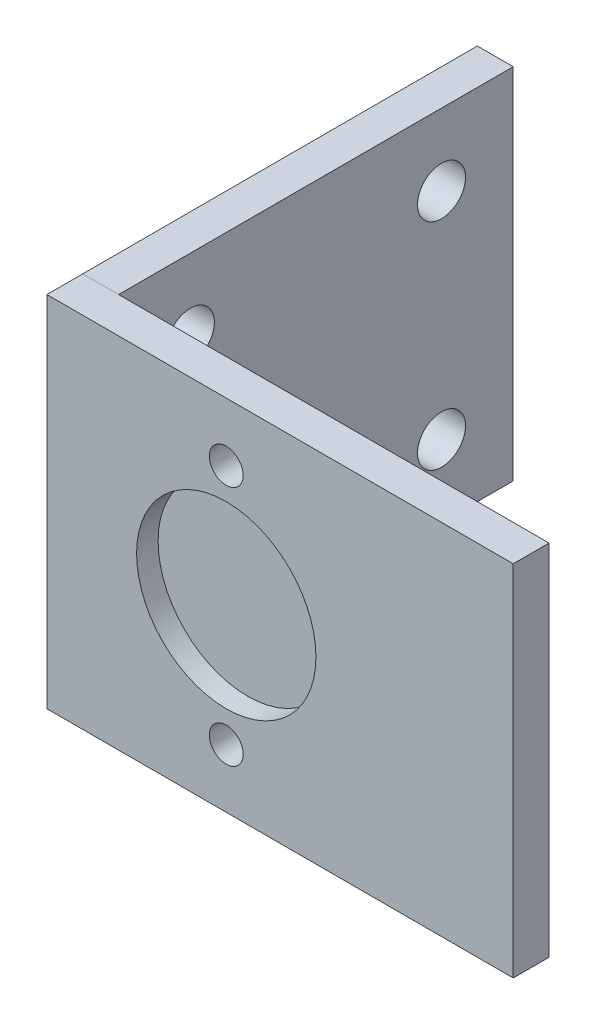
ISO-10303-21;
HEADER;
FILE_DESCRIPTION(('STEP AP214'),'2;1');
FILE_NAME('part.step','',(''),(''),'','','');
FILE_SCHEMA(('AUTOMOTIVE_DESIGN { 1 0 10303 214 1 1 1 1 }'));
ENDSEC;
DATA;
#1=APPLICATION_CONTEXT('core data for automotive mechanical design processes');
#2=APPLICATION_PROTOCOL_DEFINITION('international standard','automotive_design',2000,#1);
#3=PRODUCT_CONTEXT('',#1,'mechanical');
#4=PRODUCT('Part','Part','',(#3));
#5=PRODUCT_RELATED_PRODUCT_CATEGORY('part','',(#4));
#6=PRODUCT_DEFINITION_FORMATION('','',#4);
#7=PRODUCT_DEFINITION_CONTEXT('part definition',#1,'design');
#8=PRODUCT_DEFINITION('design','',#6,#7);
#9=PRODUCT_DEFINITION_SHAPE('','',#8);
#10=(LENGTH_UNIT() NAMED_UNIT(*) SI_UNIT(.MILLI.,.METRE.));
#11=(NAMED_UNIT(*) PLANE_ANGLE_UNIT() SI_UNIT($,.RADIAN.));
#12=(NAMED_UNIT(*) SI_UNIT($,.STERADIAN.) SOLID_ANGLE_UNIT());
#13=UNCERTAINTY_MEASURE_WITH_UNIT(LENGTH_MEASURE(1.E-05),#10,'distance_accuracy_value','');
#14=(GEOMETRIC_REPRESENTATION_CONTEXT(3) GLOBAL_UNCERTAINTY_ASSIGNED_CONTEXT((#13)) GLOBAL_UNIT_ASSIGNED_CONTEXT((#10,
#11,#12)) REPRESENTATION_CONTEXT('',''));
#15=CARTESIAN_POINT('',(0.,0.,0.));
#16=DIRECTION('',(0.,0.,1.));
#17=DIRECTION('',(1.,0.,0.));
#18=AXIS2_PLACEMENT_3D('',#15,#16,#17);
#19=CARTESIAN_POINT('',(0.,16.736305379031,45.8468437795348));
#20=DIRECTION('',(0.,0.,-1.));
#21=DIRECTION('',(-1.,0.,0.));
#22=AXIS2_PLACEMENT_3D('',#19,#20,#21);
#23=PLANE('',#22);
#24=CARTESIAN_POINT('',(12.7,12.5863053790309,45.8468437795348));
#25=DIRECTION('',(0.,0.,-1.));
#26=DIRECTION('',(-1.,0.,0.));
#27=AXIS2_PLACEMENT_3D('',#24,#25,#26);
#28=CIRCLE('',#27,1.19999999999999);
#29=CARTESIAN_POINT('',(11.5,12.5863053790309,45.8468437795348));
#30=VERTEX_POINT('',#29);
#31=EDGE_CURVE('E142',#30,#30,#28,.T.);
#32=ORIENTED_EDGE('',*,*,#31,.F.);
#33=EDGE_LOOP('',(#32));
#34=FACE_BOUND('',#33,.T.);
#35=CARTESIAN_POINT('',(12.7,-4.51369462096898,45.8468437795348));
#36=DIRECTION('',(0.,0.,-1.));
#37=DIRECTION('',(-1.,0.,0.));
#38=AXIS2_PLACEMENT_3D('',#35,#36,#37);
#39=CIRCLE('',#38,1.19999999999999);
#40=CARTESIAN_POINT('',(11.5,-4.51369462096898,45.8468437795348));
#41=VERTEX_POINT('',#40);
#42=EDGE_CURVE('E103',#41,#41,#39,.T.);
#43=ORIENTED_EDGE('',*,*,#42,.F.);
#44=EDGE_LOOP('',(#43));
#45=FACE_BOUND('',#44,.T.);
#46=DIRECTION('',(1.,0.,0.));
#47=VECTOR('',#46,1.);
#48=CARTESIAN_POINT('',(0.,16.736305379031,45.8468437795348));
#49=LINE('',#48,#47);
#50=CARTESIAN_POINT('',(0.,16.736305379031,45.8468437795348));
#51=VERTEX_POINT('',#50);
#52=CARTESIAN_POINT('',(33.02,16.736305379031,45.8468437795348));
#53=VERTEX_POINT('',#52);
#54=EDGE_CURVE('E48',#51,#53,#49,.T.);
#55=ORIENTED_EDGE('',*,*,#54,.T.);
#56=DIRECTION('',(0.,1.,0.));
#57=VECTOR('',#56,1.);
#58=CARTESIAN_POINT('',(33.02,16.736305379031,45.8468437795348));
#59=LINE('',#58,#57);
#60=CARTESIAN_POINT('',(33.02,-8.66369462096904,45.8468437795348));
#61=VERTEX_POINT('',#60);
#62=EDGE_CURVE('E85',#61,#53,#59,.T.);
#63=ORIENTED_EDGE('',*,*,#62,.F.);
#64=DIRECTION('',(1.,0.,0.));
#65=VECTOR('',#64,1.);
#66=CARTESIAN_POINT('',(0.,-8.66369462096904,45.8468437795348));
#67=LINE('',#66,#65);
#68=CARTESIAN_POINT('',(0.,-8.66369462096904,45.8468437795348));
#69=VERTEX_POINT('',#68);
#70=EDGE_CURVE('E12',#69,#61,#67,.T.);
#71=ORIENTED_EDGE('',*,*,#70,.F.);
#72=DIRECTION('',(0.,1.,0.));
#73=VECTOR('',#72,1.);
#74=CARTESIAN_POINT('',(0.,16.736305379031,45.8468437795348));
#75=LINE('',#74,#73);
#76=EDGE_CURVE('E86',#69,#51,#75,.T.);
#77=ORIENTED_EDGE('',*,*,#76,.T.);
#78=EDGE_LOOP('',(#55,#63,#71,#77));
#79=FACE_BOUND('',#78,.T.);
#80=ADVANCED_FACE('F45',(#34,#45,#79),#23,.T.);
#81=CARTESIAN_POINT('',(0.,-8.66369462096904,48.3868437795348));
#82=DIRECTION('',(0.,-1.,0.));
#83=DIRECTION('',(0.,0.,-1.));
#84=AXIS2_PLACEMENT_3D('',#81,#82,#83);
#85=PLANE('',#84);
#86=ORIENTED_EDGE('',*,*,#70,.T.);
#87=DIRECTION('',(0.,0.,-1.));
#88=VECTOR('',#87,1.);
#89=CARTESIAN_POINT('',(33.02,-8.66369462096904,48.3868437795348));
#90=LINE('',#89,#88);
#91=CARTESIAN_POINT('',(33.02,-8.66369462096904,48.3868437795348));
#92=VERTEX_POINT('',#91);
#93=EDGE_CURVE('E102',#92,#61,#90,.T.);
#94=ORIENTED_EDGE('',*,*,#93,.F.);
#95=DIRECTION('',(1.,0.,0.));
#96=VECTOR('',#95,1.);
#97=CARTESIAN_POINT('',(0.,-8.66369462096904,48.3868437795348));
#98=LINE('',#97,#96);
#99=CARTESIAN_POINT('',(0.,-8.66369462096904,48.3868437795348));
#100=VERTEX_POINT('',#99);
#101=EDGE_CURVE('E53',#100,#92,#98,.T.);
#102=ORIENTED_EDGE('',*,*,#101,.F.);
#103=DIRECTION('',(0.,0.,-1.));
#104=VECTOR('',#103,1.);
#105=CARTESIAN_POINT('',(0.,-8.66369462096904,48.3868437795348));
#106=LINE('',#105,#104);
#107=EDGE_CURVE('E91',#100,#69,#106,.T.);
#108=ORIENTED_EDGE('',*,*,#107,.T.);
#109=EDGE_LOOP('',(#86,#94,#102,#108));
#110=FACE_BOUND('',#109,.T.);
#111=ADVANCED_FACE('F122',(#110),#85,.T.);
#112=CARTESIAN_POINT('',(0.,16.736305379031,48.3868437795348));
#113=DIRECTION('',(0.,0.,1.));
#114=DIRECTION('',(1.,0.,0.));
#115=AXIS2_PLACEMENT_3D('',#112,#113,#114);
#116=PLANE('',#115);
#117=CARTESIAN_POINT('',(12.7,4.03630537903097,48.3868437795348));
#118=DIRECTION('',(0.,0.,1.));
#119=DIRECTION('',(1.,0.,0.));
#120=AXIS2_PLACEMENT_3D('',#117,#118,#119);
#121=CIRCLE('',#120,6.35);
#122=CARTESIAN_POINT('',(19.05,4.03630537903097,48.3868437795348));
#123=VERTEX_POINT('',#122);
#124=EDGE_CURVE('E158',#123,#123,#121,.T.);
#125=ORIENTED_EDGE('',*,*,#124,.F.);
#126=EDGE_LOOP('',(#125));
#127=FACE_BOUND('',#126,.T.);
#128=CARTESIAN_POINT('',(12.7,12.5863053790309,48.3868437795348));
#129=DIRECTION('',(0.,0.,1.));
#130=DIRECTION('',(1.,0.,0.));
#131=AXIS2_PLACEMENT_3D('',#128,#129,#130);
#132=CIRCLE('',#131,1.19999999999999);
#133=CARTESIAN_POINT('',(13.9,12.5863053790309,48.3868437795348));
#134=VERTEX_POINT('',#133);
#135=EDGE_CURVE('E152',#134,#134,#132,.T.);
#136=ORIENTED_EDGE('',*,*,#135,.F.);
#137=EDGE_LOOP('',(#136));
#138=FACE_BOUND('',#137,.T.);
#139=CARTESIAN_POINT('',(12.7,-4.51369462096898,48.3868437795348));
#140=DIRECTION('',(0.,0.,1.));
#141=DIRECTION('',(1.,0.,0.));
#142=AXIS2_PLACEMENT_3D('',#139,#140,#141);
#143=CIRCLE('',#142,1.19999999999999);
#144=CARTESIAN_POINT('',(13.9,-4.51369462096898,48.3868437795348));
#145=VERTEX_POINT('',#144);
#146=EDGE_CURVE('E106',#145,#145,#143,.T.);
#147=ORIENTED_EDGE('',*,*,#146,.F.);
#148=EDGE_LOOP('',(#147));
#149=FACE_BOUND('',#148,.T.);
#150=ORIENTED_EDGE('',*,*,#101,.T.);
#151=DIRECTION('',(0.,-1.,0.));
#152=VECTOR('',#151,1.);
#153=CARTESIAN_POINT('',(33.02,16.736305379031,48.3868437795348));
#154=LINE('',#153,#152);
#155=CARTESIAN_POINT('',(33.02,16.736305379031,48.3868437795348));
#156=VERTEX_POINT('',#155);
#157=EDGE_CURVE('E98',#156,#92,#154,.T.);
#158=ORIENTED_EDGE('',*,*,#157,.F.);
#159=DIRECTION('',(1.,0.,0.));
#160=VECTOR('',#159,1.);
#161=CARTESIAN_POINT('',(0.,16.736305379031,48.3868437795348));
#162=LINE('',#161,#160);
#163=CARTESIAN_POINT('',(0.,16.736305379031,48.3868437795348));
#164=VERTEX_POINT('',#163);
#165=EDGE_CURVE('E90',#164,#156,#162,.T.);
#166=ORIENTED_EDGE('',*,*,#165,.F.);
#167=DIRECTION('',(0.,-1.,0.));
#168=VECTOR('',#167,1.);
#169=CARTESIAN_POINT('',(0.,16.736305379031,48.3868437795348));
#170=LINE('',#169,#168);
#171=EDGE_CURVE('E115',#164,#100,#170,.T.);
#172=ORIENTED_EDGE('',*,*,#171,.T.);
#173=EDGE_LOOP('',(#150,#158,#166,#172));
#174=FACE_BOUND('',#173,.T.);
#175=ADVANCED_FACE('F119',(#127,#138,#149,#174),#116,.T.);
#176=CARTESIAN_POINT('',(0.,16.736305379031,45.8468437795348));
#177=DIRECTION('',(0.,1.,0.));
#178=DIRECTION('',(0.,0.,1.));
#179=AXIS2_PLACEMENT_3D('',#176,#177,#178);
#180=PLANE('',#179);
#181=ORIENTED_EDGE('',*,*,#165,.T.);
#182=DIRECTION('',(0.,0.,1.));
#183=VECTOR('',#182,1.);
#184=CARTESIAN_POINT('',(33.02,16.736305379031,45.8468437795348));
#185=LINE('',#184,#183);
#186=EDGE_CURVE('E93',#53,#156,#185,.T.);
#187=ORIENTED_EDGE('',*,*,#186,.F.);
#188=ORIENTED_EDGE('',*,*,#54,.F.);
#189=DIRECTION('',(0.,0.,1.));
#190=VECTOR('',#189,1.);
#191=CARTESIAN_POINT('',(0.,16.736305379031,45.8468437795348));
#192=LINE('',#191,#190);
#193=EDGE_CURVE('E113',#51,#164,#192,.T.);
#194=ORIENTED_EDGE('',*,*,#193,.T.);
#195=EDGE_LOOP('',(#181,#187,#188,#194));
#196=FACE_BOUND('',#195,.T.);
#197=ADVANCED_FACE('F94',(#196),#180,.T.);
#198=CARTESIAN_POINT('',(0.,0.,0.));
#199=DIRECTION('',(1.,0.,0.));
#200=DIRECTION('',(0.,0.,-1.));
#201=AXIS2_PLACEMENT_3D('',#198,#199,#200);
#202=PLANE('',#201);
#203=ORIENTED_EDGE('',*,*,#76,.F.);
#204=ORIENTED_EDGE('',*,*,#107,.F.);
#205=ORIENTED_EDGE('',*,*,#171,.F.);
#206=ORIENTED_EDGE('',*,*,#193,.F.);
#207=EDGE_LOOP('',(#203,#204,#205,#206));
#208=FACE_BOUND('',#207,.T.);
#209=ADVANCED_FACE('F124',(#208),#202,.F.);
#210=CARTESIAN_POINT('',(33.02,0.,0.));
#211=DIRECTION('',(1.,0.,0.));
#212=DIRECTION('',(0.,0.,-1.));
#213=AXIS2_PLACEMENT_3D('',#210,#211,#212);
#214=PLANE('',#213);
#215=ORIENTED_EDGE('',*,*,#62,.T.);
#216=ORIENTED_EDGE('',*,*,#186,.T.);
#217=ORIENTED_EDGE('',*,*,#157,.T.);
#218=ORIENTED_EDGE('',*,*,#93,.T.);
#219=EDGE_LOOP('',(#215,#216,#217,#218));
#220=FACE_BOUND('',#219,.T.);
#221=ADVANCED_FACE('F101',(#220),#214,.T.);
#222=CARTESIAN_POINT('',(12.7,-4.51369462096898,48.3868437795348));
#223=DIRECTION('',(0.,0.,1.));
#224=DIRECTION('',(1.,0.,0.));
#225=AXIS2_PLACEMENT_3D('',#222,#223,#224);
#226=CYLINDRICAL_SURFACE('',#225,1.19999999999999);
#227=ORIENTED_EDGE('',*,*,#42,.T.);
#228=EDGE_LOOP('',(#227));
#229=FACE_BOUND('',#228,.T.);
#230=ORIENTED_EDGE('',*,*,#146,.T.);
#231=EDGE_LOOP('',(#230));
#232=FACE_BOUND('',#231,.T.);
#233=ADVANCED_FACE('F131',(#229,#232),#226,.F.);
#234=CARTESIAN_POINT('',(12.7,12.5863053790309,48.3868437795348));
#235=DIRECTION('',(0.,0.,1.));
#236=DIRECTION('',(1.,0.,0.));
#237=AXIS2_PLACEMENT_3D('',#234,#235,#236);
#238=CYLINDRICAL_SURFACE('',#237,1.19999999999999);
#239=ORIENTED_EDGE('',*,*,#31,.T.);
#240=EDGE_LOOP('',(#239));
#241=FACE_BOUND('',#240,.T.);
#242=ORIENTED_EDGE('',*,*,#135,.T.);
#243=EDGE_LOOP('',(#242));
#244=FACE_BOUND('',#243,.T.);
#245=ADVANCED_FACE('F147',(#241,#244),#238,.F.);
#246=CARTESIAN_POINT('',(12.7,4.03630537903097,46.8628437795348));
#247=DIRECTION('',(0.,0.,1.));
#248=DIRECTION('',(1.,0.,0.));
#249=AXIS2_PLACEMENT_3D('',#246,#247,#248);
#250=CYLINDRICAL_SURFACE('',#249,6.35);
#251=CARTESIAN_POINT('',(12.7,4.03630537903097,46.8628437795348));
#252=DIRECTION('',(0.,0.,1.));
#253=DIRECTION('',(1.,0.,0.));
#254=AXIS2_PLACEMENT_3D('',#251,#252,#253);
#255=CIRCLE('',#254,6.35);
#256=CARTESIAN_POINT('',(19.05,4.03630537903097,46.8628437795348));
#257=VERTEX_POINT('',#256);
#258=EDGE_CURVE('E157',#257,#257,#255,.T.);
#259=CARTESIAN_POINT('',(19.05,4.03630537903097,46.8628437795348));
#260=CARTESIAN_POINT('',(19.05,4.03630537903097,46.8787187795348));
#261=CARTESIAN_POINT('',(19.05,4.03630537903097,46.8945937795348));
#262=CARTESIAN_POINT('',(19.05,4.03630537903097,46.9263437795348));
#263=CARTESIAN_POINT('',(19.05,4.03630537903097,46.9422187795348));
#264=CARTESIAN_POINT('',(19.05,4.03630537903097,46.9739687795348));
#265=CARTESIAN_POINT('',(19.05,4.03630537903097,46.9898437795348));
#266=CARTESIAN_POINT('',(19.05,4.03630537903097,47.0215937795348));
#267=CARTESIAN_POINT('',(19.05,4.03630537903097,47.0374687795348));
#268=CARTESIAN_POINT('',(19.05,4.03630537903097,47.0692187795348));
#269=CARTESIAN_POINT('',(19.05,4.03630537903097,47.0850937795348));
#270=CARTESIAN_POINT('',(19.05,4.03630537903097,47.1168437795348));
#271=CARTESIAN_POINT('',(19.05,4.03630537903097,47.1327187795348));
#272=CARTESIAN_POINT('',(19.05,4.03630537903097,47.1644687795348));
#273=CARTESIAN_POINT('',(19.05,4.03630537903097,47.1803437795348));
#274=CARTESIAN_POINT('',(19.05,4.03630537903097,47.2120937795348));
#275=CARTESIAN_POINT('',(19.05,4.03630537903097,47.2279687795348));
#276=CARTESIAN_POINT('',(19.05,4.03630537903097,47.2597187795348));
#277=CARTESIAN_POINT('',(19.05,4.03630537903097,47.2755937795348));
#278=CARTESIAN_POINT('',(19.05,4.03630537903097,47.3073437795348));
#279=CARTESIAN_POINT('',(19.05,4.03630537903097,47.3232187795348));
#280=CARTESIAN_POINT('',(19.05,4.03630537903097,47.3549687795348));
#281=CARTESIAN_POINT('',(19.05,4.03630537903097,47.3708437795348));
#282=CARTESIAN_POINT('',(19.05,4.03630537903097,47.4025937795348));
#283=CARTESIAN_POINT('',(19.05,4.03630537903097,47.4184687795348));
#284=CARTESIAN_POINT('',(19.05,4.03630537903097,47.4502187795348));
#285=CARTESIAN_POINT('',(19.05,4.03630537903097,47.4660937795348));
#286=CARTESIAN_POINT('',(19.05,4.03630537903097,47.4978437795348));
#287=CARTESIAN_POINT('',(19.05,4.03630537903097,47.5137187795348));
#288=CARTESIAN_POINT('',(19.05,4.03630537903097,47.5454687795348));
#289=CARTESIAN_POINT('',(19.05,4.03630537903097,47.5613437795348));
#290=CARTESIAN_POINT('',(19.05,4.03630537903097,47.5930937795348));
#291=CARTESIAN_POINT('',(19.05,4.03630537903097,47.6089687795348));
#292=CARTESIAN_POINT('',(19.05,4.03630537903097,47.6407187795348));
#293=CARTESIAN_POINT('',(19.05,4.03630537903097,47.6565937795348));
#294=CARTESIAN_POINT('',(19.05,4.03630537903097,47.6883437795348));
#295=CARTESIAN_POINT('',(19.05,4.03630537903097,47.7042187795348));
#296=CARTESIAN_POINT('',(19.05,4.03630537903097,47.7359687795348));
#297=CARTESIAN_POINT('',(19.05,4.03630537903097,47.7518437795348));
#298=CARTESIAN_POINT('',(19.05,4.03630537903097,47.7835937795348));
#299=CARTESIAN_POINT('',(19.05,4.03630537903097,47.7994687795348));
#300=CARTESIAN_POINT('',(19.05,4.03630537903097,47.8312187795348));
#301=CARTESIAN_POINT('',(19.05,4.03630537903097,47.8470937795348));
#302=CARTESIAN_POINT('',(19.05,4.03630537903097,47.8788437795348));
#303=CARTESIAN_POINT('',(19.05,4.03630537903097,47.8947187795348));
#304=CARTESIAN_POINT('',(19.05,4.03630537903097,47.9264687795348));
#305=CARTESIAN_POINT('',(19.05,4.03630537903097,47.9423437795348));
#306=CARTESIAN_POINT('',(19.05,4.03630537903097,47.9740937795348));
#307=CARTESIAN_POINT('',(19.05,4.03630537903097,47.9899687795348));
#308=CARTESIAN_POINT('',(19.05,4.03630537903097,48.0217187795348));
#309=CARTESIAN_POINT('',(19.05,4.03630537903097,48.0375937795348));
#310=CARTESIAN_POINT('',(19.05,4.03630537903097,48.0693437795348));
#311=CARTESIAN_POINT('',(19.05,4.03630537903097,48.0852187795348));
#312=CARTESIAN_POINT('',(19.05,4.03630537903097,48.1169687795348));
#313=CARTESIAN_POINT('',(19.05,4.03630537903097,48.1328437795348));
#314=CARTESIAN_POINT('',(19.05,4.03630537903097,48.1645937795348));
#315=CARTESIAN_POINT('',(19.05,4.03630537903097,48.1804687795348));
#316=CARTESIAN_POINT('',(19.05,4.03630537903097,48.2122187795348));
#317=CARTESIAN_POINT('',(19.05,4.03630537903097,48.2280937795348));
#318=CARTESIAN_POINT('',(19.05,4.03630537903097,48.2598437795348));
#319=CARTESIAN_POINT('',(19.05,4.03630537903097,48.2757187795348));
#320=CARTESIAN_POINT('',(19.05,4.03630537903097,48.3074687795348));
#321=CARTESIAN_POINT('',(19.05,4.03630537903097,48.3233437795348));
#322=CARTESIAN_POINT('',(19.05,4.03630537903097,48.3550937795348));
#323=CARTESIAN_POINT('',(19.05,4.03630537903097,48.3709687795348));
#324=CARTESIAN_POINT('',(19.05,4.03630537903097,48.3868437795348));
#325=B_SPLINE_CURVE_WITH_KNOTS('',3,(#259,#260,#261,#262,#263,#264,#265,#266,#267,#268,#269,
#270,#271,#272,#273,#274,#275,#276,#277,#278,#279,#280,#281,#282,#283,#284,#285,#286,#287,#288,
#289,#290,#291,#292,#293,#294,#295,#296,#297,#298,#299,#300,#301,#302,#303,#304,#305,#306,#307,
#308,#309,#310,#311,#312,#313,#314,#315,#316,#317,#318,#319,#320,#321,#322,#323,#324),
.UNSPECIFIED.,.F.,.F.,(4,2,2,2,2,2,2,2,2,2,2,2,2,2,2,2,2,2,2,2,2,2,2,2,2,2,2,2,2,2,2,2,4),(0.,
0.0476249999999956,0.0952499999999981,0.142874999999994,0.190499999999996,0.238124999999999,
0.285749999999994,0.333374999999997,0.380999999999992,0.428624999999995,0.476249999999998,
0.523874999999993,0.571499999999996,0.619124999999998,0.666749999999994,0.714374999999996,
0.761999999999992,0.809624999999994,0.857249999999997,0.904874999999993,0.952499999999995,
1.000125,1.04774999999999,1.095375,1.14299999999999,1.19062499999999,1.23825,1.28587499999999,
1.33349999999999,1.381125,1.42874999999999,1.476375,1.52399999999999),.UNSPECIFIED.);
#326=EDGE_CURVE('BSEAM166',#257,#123,#325,.T.);
#327=ORIENTED_EDGE('',*,*,#258,.F.);
#328=ORIENTED_EDGE('',*,*,#124,.T.);
#329=ORIENTED_EDGE('',*,*,#326,.T.);
#330=ORIENTED_EDGE('',*,*,#326,.F.);
#331=EDGE_LOOP('',(#327,#329,#328,#330));
#332=FACE_BOUND('',#331,.T.);
#333=ADVANCED_FACE('F166',(#332),#250,.F.);
#334=CARTESIAN_POINT('',(12.7,4.03630537903097,46.8628437795348));
#335=DIRECTION('',(0.,0.,1.));
#336=DIRECTION('',(1.,0.,0.));
#337=AXIS2_PLACEMENT_3D('',#334,#335,#336);
#338=PLANE('',#337);
#339=ORIENTED_EDGE('',*,*,#258,.T.);
#340=EDGE_LOOP('',(#339));
#341=FACE_BOUND('',#340,.T.);
#342=ADVANCED_FACE('F164',(#341),#338,.T.);
#343=CLOSED_SHELL('',(#80,#111,#175,#197,#209,#221,#233,#245,#333,#342));
#344=MANIFOLD_SOLID_BREP('B2',#343);
#345=CARTESIAN_POINT('',(0.,0.,0.));
#346=DIRECTION('',(-1.,0.,0.));
#347=DIRECTION('',(0.,0.,1.));
#348=AXIS2_PLACEMENT_3D('',#345,#346,#347);
#349=PLANE('',#348);
#350=CARTESIAN_POINT('',(0.,11.656305379031,40.7668437795348));
#351=DIRECTION('',(1.,0.,0.));
#352=DIRECTION('',(0.,0.,-1.));
#353=AXIS2_PLACEMENT_3D('',#350,#351,#352);
#354=CIRCLE('',#353,1.69999999999999);
#355=CARTESIAN_POINT('',(0.,11.656305379031,39.0668437795348));
#356=VERTEX_POINT('',#355);
#357=EDGE_CURVE('E335',#356,#356,#354,.T.);
#358=ORIENTED_EDGE('',*,*,#357,.T.);
#359=EDGE_LOOP('',(#358));
#360=FACE_BOUND('',#359,.T.);
#361=DIRECTION('',(0.,-1.,0.));
#362=VECTOR('',#361,1.);
#363=CARTESIAN_POINT('',(0.,-8.66369462096904,45.8468437795348));
#364=LINE('',#363,#362);
#365=CARTESIAN_POINT('',(0.,16.736305379031,45.8468437795348));
#366=VERTEX_POINT('',#365);
#367=CARTESIAN_POINT('',(0.,-8.66369462096904,45.8468437795348));
#368=VERTEX_POINT('',#367);
#369=EDGE_CURVE('E304',#366,#368,#364,.T.);
#370=ORIENTED_EDGE('',*,*,#369,.F.);
#371=DIRECTION('',(0.,0.,1.));
#372=VECTOR('',#371,1.);
#373=CARTESIAN_POINT('',(0.,16.736305379031,45.8468437795348));
#374=LINE('',#373,#372);
#375=CARTESIAN_POINT('',(0.,16.736305379031,17.9068437795348));
#376=VERTEX_POINT('',#375);
#377=EDGE_CURVE('E280',#376,#366,#374,.T.);
#378=ORIENTED_EDGE('',*,*,#377,.F.);
#379=DIRECTION('',(0.,1.,0.));
#380=VECTOR('',#379,1.);
#381=CARTESIAN_POINT('',(0.,-8.66369462096904,17.9068437795348));
#382=LINE('',#381,#380);
#383=CARTESIAN_POINT('',(0.,-8.66369462096904,17.9068437795348));
#384=VERTEX_POINT('',#383);
#385=EDGE_CURVE('E274',#384,#376,#382,.T.);
#386=ORIENTED_EDGE('',*,*,#385,.F.);
#387=DIRECTION('',(0.,0.,-1.));
#388=VECTOR('',#387,1.);
#389=CARTESIAN_POINT('',(0.,-8.66369462096904,45.8468437795348));
#390=LINE('',#389,#388);
#391=EDGE_CURVE('E296',#368,#384,#390,.T.);
#392=ORIENTED_EDGE('',*,*,#391,.F.);
#393=EDGE_LOOP('',(#370,#378,#386,#392));
#394=FACE_BOUND('',#393,.T.);
#395=CARTESIAN_POINT('',(0.,-3.58369462096905,40.7668437795348));
#396=DIRECTION('',(1.,0.,0.));
#397=DIRECTION('',(0.,0.,-1.));
#398=AXIS2_PLACEMENT_3D('',#395,#396,#397);
#399=CIRCLE('',#398,1.69999999999999);
#400=CARTESIAN_POINT('',(0.,-3.58369462096905,39.0668437795348));
#401=VERTEX_POINT('',#400);
#402=EDGE_CURVE('E307',#401,#401,#399,.T.);
#403=ORIENTED_EDGE('',*,*,#402,.T.);
#404=EDGE_LOOP('',(#403));
#405=FACE_BOUND('',#404,.T.);
#406=CARTESIAN_POINT('',(0.,-3.58369462096905,22.9868437795348));
#407=DIRECTION('',(1.,0.,0.));
#408=DIRECTION('',(0.,0.,-1.));
#409=AXIS2_PLACEMENT_3D('',#406,#407,#408);
#410=CIRCLE('',#409,1.69999999999999);
#411=CARTESIAN_POINT('',(0.,-3.58369462096905,21.2868437795348));
#412=VERTEX_POINT('',#411);
#413=EDGE_CURVE('E323',#412,#412,#410,.T.);
#414=ORIENTED_EDGE('',*,*,#413,.T.);
#415=EDGE_LOOP('',(#414));
#416=FACE_BOUND('',#415,.T.);
#417=CARTESIAN_POINT('',(0.,11.656305379031,22.9868437795348));
#418=DIRECTION('',(1.,0.,0.));
#419=DIRECTION('',(0.,0.,-1.));
#420=AXIS2_PLACEMENT_3D('',#417,#418,#419);
#421=CIRCLE('',#420,1.69999999999999);
#422=CARTESIAN_POINT('',(0.,11.656305379031,21.2868437795348));
#423=VERTEX_POINT('',#422);
#424=EDGE_CURVE('E329',#423,#423,#421,.T.);
#425=ORIENTED_EDGE('',*,*,#424,.T.);
#426=EDGE_LOOP('',(#425));
#427=FACE_BOUND('',#426,.T.);
#428=ADVANCED_FACE('F240',(#360,#394,#405,#416,#427),#349,.T.);
#429=CARTESIAN_POINT('',(2.54,-8.66369462096904,45.8468437795348));
#430=DIRECTION('',(0.,0.,-1.));
#431=DIRECTION('',(-1.,0.,0.));
#432=AXIS2_PLACEMENT_3D('',#429,#430,#431);
#433=PLANE('',#432);
#434=ORIENTED_EDGE('',*,*,#369,.T.);
#435=DIRECTION('',(-1.,0.,0.));
#436=VECTOR('',#435,1.);
#437=CARTESIAN_POINT('',(2.54,-8.66369462096904,45.8468437795348));
#438=LINE('',#437,#436);
#439=CARTESIAN_POINT('',(2.54,-8.66369462096904,45.8468437795348));
#440=VERTEX_POINT('',#439);
#441=EDGE_CURVE('E43',#440,#368,#438,.T.);
#442=ORIENTED_EDGE('',*,*,#441,.F.);
#443=DIRECTION('',(0.,-1.,0.));
#444=VECTOR('',#443,1.);
#445=CARTESIAN_POINT('',(2.54,-8.66369462096904,45.8468437795348));
#446=LINE('',#445,#444);
#447=CARTESIAN_POINT('',(2.54,16.736305379031,45.8468437795348));
#448=VERTEX_POINT('',#447);
#449=EDGE_CURVE('E292',#448,#440,#446,.T.);
#450=ORIENTED_EDGE('',*,*,#449,.F.);
#451=DIRECTION('',(-1.,0.,0.));
#452=VECTOR('',#451,1.);
#453=CARTESIAN_POINT('',(2.54,16.736305379031,45.8468437795348));
#454=LINE('',#453,#452);
#455=EDGE_CURVE('E300',#448,#366,#454,.T.);
#456=ORIENTED_EDGE('',*,*,#455,.T.);
#457=EDGE_LOOP('',(#434,#442,#450,#456));
#458=FACE_BOUND('',#457,.T.);
#459=ADVANCED_FACE('F242',(#458),#433,.F.);
#460=CARTESIAN_POINT('',(2.54,-8.66369462096904,45.8468437795348));
#461=DIRECTION('',(0.,1.,0.));
#462=DIRECTION('',(0.,0.,1.));
#463=AXIS2_PLACEMENT_3D('',#460,#461,#462);
#464=PLANE('',#463);
#465=ORIENTED_EDGE('',*,*,#391,.T.);
#466=DIRECTION('',(-1.,0.,0.));
#467=VECTOR('',#466,1.);
#468=CARTESIAN_POINT('',(2.54,-8.66369462096904,17.9068437795348));
#469=LINE('',#468,#467);
#470=CARTESIAN_POINT('',(2.54,-8.66369462096904,17.9068437795348));
#471=VERTEX_POINT('',#470);
#472=EDGE_CURVE('E249',#471,#384,#469,.T.);
#473=ORIENTED_EDGE('',*,*,#472,.F.);
#474=DIRECTION('',(0.,0.,-1.));
#475=VECTOR('',#474,1.);
#476=CARTESIAN_POINT('',(2.54,-8.66369462096904,45.8468437795348));
#477=LINE('',#476,#475);
#478=EDGE_CURVE('E287',#440,#471,#477,.T.);
#479=ORIENTED_EDGE('',*,*,#478,.F.);
#480=ORIENTED_EDGE('',*,*,#441,.T.);
#481=EDGE_LOOP('',(#465,#473,#479,#480));
#482=FACE_BOUND('',#481,.T.);
#483=ADVANCED_FACE('F295',(#482),#464,.F.);
#484=CARTESIAN_POINT('',(2.54,-8.66369462096904,17.9068437795348));
#485=DIRECTION('',(0.,0.,1.));
#486=DIRECTION('',(1.,0.,0.));
#487=AXIS2_PLACEMENT_3D('',#484,#485,#486);
#488=PLANE('',#487);
#489=ORIENTED_EDGE('',*,*,#385,.T.);
#490=DIRECTION('',(-1.,0.,0.));
#491=VECTOR('',#490,1.);
#492=CARTESIAN_POINT('',(2.54,16.736305379031,17.9068437795348));
#493=LINE('',#492,#491);
#494=CARTESIAN_POINT('',(2.54,16.736305379031,17.9068437795348));
#495=VERTEX_POINT('',#494);
#496=EDGE_CURVE('E297',#495,#376,#493,.T.);
#497=ORIENTED_EDGE('',*,*,#496,.F.);
#498=DIRECTION('',(0.,1.,0.));
#499=VECTOR('',#498,1.);
#500=CARTESIAN_POINT('',(2.54,-8.66369462096904,17.9068437795348));
#501=LINE('',#500,#499);
#502=EDGE_CURVE('E290',#471,#495,#501,.T.);
#503=ORIENTED_EDGE('',*,*,#502,.F.);
#504=ORIENTED_EDGE('',*,*,#472,.T.);
#505=EDGE_LOOP('',(#489,#497,#503,#504));
#506=FACE_BOUND('',#505,.T.);
#507=ADVANCED_FACE('F298',(#506),#488,.F.);
#508=CARTESIAN_POINT('',(2.54,16.736305379031,45.8468437795348));
#509=DIRECTION('',(0.,-1.,0.));
#510=DIRECTION('',(0.,0.,-1.));
#511=AXIS2_PLACEMENT_3D('',#508,#509,#510);
#512=PLANE('',#511);
#513=ORIENTED_EDGE('',*,*,#377,.T.);
#514=ORIENTED_EDGE('',*,*,#455,.F.);
#515=DIRECTION('',(0.,0.,1.));
#516=VECTOR('',#515,1.);
#517=CARTESIAN_POINT('',(2.54,16.736305379031,45.8468437795348));
#518=LINE('',#517,#516);
#519=EDGE_CURVE('E257',#495,#448,#518,.T.);
#520=ORIENTED_EDGE('',*,*,#519,.F.);
#521=ORIENTED_EDGE('',*,*,#496,.T.);
#522=EDGE_LOOP('',(#513,#514,#520,#521));
#523=FACE_BOUND('',#522,.T.);
#524=ADVANCED_FACE('F312',(#523),#512,.F.);
#525=CARTESIAN_POINT('',(2.54,0.,0.));
#526=DIRECTION('',(-1.,0.,0.));
#527=DIRECTION('',(0.,0.,1.));
#528=AXIS2_PLACEMENT_3D('',#525,#526,#527);
#529=PLANE('',#528);
#530=CARTESIAN_POINT('',(2.54,11.656305379031,40.7668437795348));
#531=DIRECTION('',(1.,0.,0.));
#532=DIRECTION('',(0.,0.,-1.));
#533=AXIS2_PLACEMENT_3D('',#530,#531,#532);
#534=CIRCLE('',#533,1.69999999999999);
#535=CARTESIAN_POINT('',(2.54,11.656305379031,39.0668437795348));
#536=VERTEX_POINT('',#535);
#537=EDGE_CURVE('E338',#536,#536,#534,.T.);
#538=ORIENTED_EDGE('',*,*,#537,.F.);
#539=EDGE_LOOP('',(#538));
#540=FACE_BOUND('',#539,.T.);
#541=CARTESIAN_POINT('',(2.54,11.656305379031,22.9868437795348));
#542=DIRECTION('',(1.,0.,0.));
#543=DIRECTION('',(0.,0.,-1.));
#544=AXIS2_PLACEMENT_3D('',#541,#542,#543);
#545=CIRCLE('',#544,1.69999999999999);
#546=CARTESIAN_POINT('',(2.54,11.656305379031,21.2868437795348));
#547=VERTEX_POINT('',#546);
#548=EDGE_CURVE('E332',#547,#547,#545,.T.);
#549=ORIENTED_EDGE('',*,*,#548,.F.);
#550=EDGE_LOOP('',(#549));
#551=FACE_BOUND('',#550,.T.);
#552=CARTESIAN_POINT('',(2.54,-3.58369462096905,22.9868437795348));
#553=DIRECTION('',(1.,0.,0.));
#554=DIRECTION('',(0.,0.,-1.));
#555=AXIS2_PLACEMENT_3D('',#552,#553,#554);
#556=CIRCLE('',#555,1.69999999999999);
#557=CARTESIAN_POINT('',(2.54,-3.58369462096905,21.2868437795348));
#558=VERTEX_POINT('',#557);
#559=EDGE_CURVE('E326',#558,#558,#556,.T.);
#560=ORIENTED_EDGE('',*,*,#559,.F.);
#561=EDGE_LOOP('',(#560));
#562=FACE_BOUND('',#561,.T.);
#563=CARTESIAN_POINT('',(2.54,-3.58369462096905,40.7668437795348));
#564=DIRECTION('',(1.,0.,0.));
#565=DIRECTION('',(0.,0.,-1.));
#566=AXIS2_PLACEMENT_3D('',#563,#564,#565);
#567=CIRCLE('',#566,1.69999999999999);
#568=CARTESIAN_POINT('',(2.54,-3.58369462096905,39.0668437795348));
#569=VERTEX_POINT('',#568);
#570=EDGE_CURVE('E320',#569,#569,#567,.T.);
#571=ORIENTED_EDGE('',*,*,#570,.F.);
#572=EDGE_LOOP('',(#571));
#573=FACE_BOUND('',#572,.T.);
#574=ORIENTED_EDGE('',*,*,#449,.T.);
#575=ORIENTED_EDGE('',*,*,#478,.T.);
#576=ORIENTED_EDGE('',*,*,#502,.T.);
#577=ORIENTED_EDGE('',*,*,#519,.T.);
#578=EDGE_LOOP('',(#574,#575,#576,#577));
#579=FACE_BOUND('',#578,.T.);
#580=ADVANCED_FACE('F288',(#540,#551,#562,#573,#579),#529,.F.);
#581=CARTESIAN_POINT('',(2.54,-3.58369462096905,40.7668437795348));
#582=DIRECTION('',(1.,0.,0.));
#583=DIRECTION('',(0.,0.,-1.));
#584=AXIS2_PLACEMENT_3D('',#581,#582,#583);
#585=CYLINDRICAL_SURFACE('',#584,1.69999999999999);
#586=ORIENTED_EDGE('',*,*,#402,.F.);
#587=EDGE_LOOP('',(#586));
#588=FACE_BOUND('',#587,.T.);
#589=ORIENTED_EDGE('',*,*,#570,.T.);
#590=EDGE_LOOP('',(#589));
#591=FACE_BOUND('',#590,.T.);
#592=ADVANCED_FACE('F346',(#588,#591),#585,.F.);
#593=CARTESIAN_POINT('',(2.54,-3.58369462096905,22.9868437795348));
#594=DIRECTION('',(1.,0.,0.));
#595=DIRECTION('',(0.,0.,-1.));
#596=AXIS2_PLACEMENT_3D('',#593,#594,#595);
#597=CYLINDRICAL_SURFACE('',#596,1.69999999999999);
#598=ORIENTED_EDGE('',*,*,#413,.F.);
#599=EDGE_LOOP('',(#598));
#600=FACE_BOUND('',#599,.T.);
#601=ORIENTED_EDGE('',*,*,#559,.T.);
#602=EDGE_LOOP('',(#601));
#603=FACE_BOUND('',#602,.T.);
#604=ADVANCED_FACE('F355',(#600,#603),#597,.F.);
#605=CARTESIAN_POINT('',(2.54,11.656305379031,22.9868437795348));
#606=DIRECTION('',(1.,0.,0.));
#607=DIRECTION('',(0.,0.,-1.));
#608=AXIS2_PLACEMENT_3D('',#605,#606,#607);
#609=CYLINDRICAL_SURFACE('',#608,1.69999999999999);
#610=ORIENTED_EDGE('',*,*,#424,.F.);
#611=EDGE_LOOP('',(#610));
#612=FACE_BOUND('',#611,.T.);
#613=ORIENTED_EDGE('',*,*,#548,.T.);
#614=EDGE_LOOP('',(#613));
#615=FACE_BOUND('',#614,.T.);
#616=ADVANCED_FACE('F361',(#612,#615),#609,.F.);
#617=CARTESIAN_POINT('',(2.54,11.656305379031,40.7668437795348));
#618=DIRECTION('',(1.,0.,0.));
#619=DIRECTION('',(0.,0.,-1.));
#620=AXIS2_PLACEMENT_3D('',#617,#618,#619);
#621=CYLINDRICAL_SURFACE('',#620,1.69999999999999);
#622=ORIENTED_EDGE('',*,*,#357,.F.);
#623=EDGE_LOOP('',(#622));
#624=FACE_BOUND('',#623,.T.);
#625=ORIENTED_EDGE('',*,*,#537,.T.);
#626=EDGE_LOOP('',(#625));
#627=FACE_BOUND('',#626,.T.);
#628=ADVANCED_FACE('F342',(#624,#627),#621,.F.);
#629=CLOSED_SHELL('',(#428,#459,#483,#507,#524,#580,#592,#604,#616,#628));
#630=MANIFOLD_SOLID_BREP('B6',#629);
#631=ADVANCED_BREP_SHAPE_REPRESENTATION('',(#18,#344,#630),#14);
#632=SHAPE_DEFINITION_REPRESENTATION(#9,#631);
ENDSEC;
END-ISO-10303-21;
